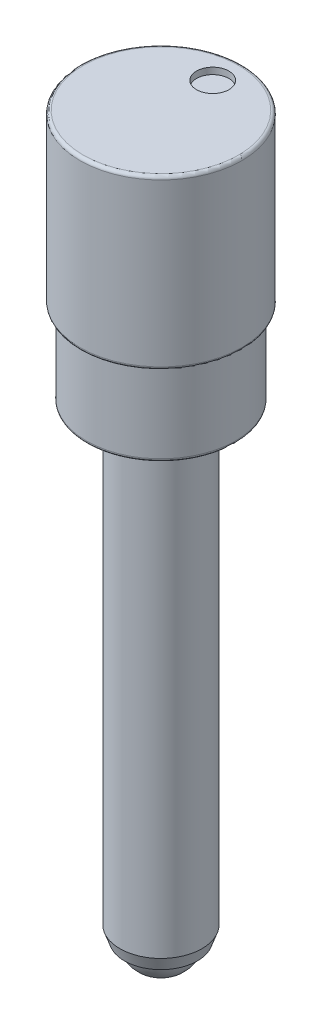
ISO-10303-21;
HEADER;
FILE_DESCRIPTION(('STEP AP214'),'2;1');
FILE_NAME('part.step','',(''),(''),'','','');
FILE_SCHEMA(('AUTOMOTIVE_DESIGN { 1 0 10303 214 1 1 1 1 }'));
ENDSEC;
DATA;
#1=APPLICATION_CONTEXT('core data for automotive mechanical design processes');
#2=APPLICATION_PROTOCOL_DEFINITION('international standard','automotive_design',2000,#1);
#3=PRODUCT_CONTEXT('',#1,'mechanical');
#4=PRODUCT('Part','Part','',(#3));
#5=PRODUCT_RELATED_PRODUCT_CATEGORY('part','',(#4));
#6=PRODUCT_DEFINITION_FORMATION('','',#4);
#7=PRODUCT_DEFINITION_CONTEXT('part definition',#1,'design');
#8=PRODUCT_DEFINITION('design','',#6,#7);
#9=PRODUCT_DEFINITION_SHAPE('','',#8);
#10=(LENGTH_UNIT() NAMED_UNIT(*) SI_UNIT(.MILLI.,.METRE.));
#11=(NAMED_UNIT(*) PLANE_ANGLE_UNIT() SI_UNIT($,.RADIAN.));
#12=(NAMED_UNIT(*) SI_UNIT($,.STERADIAN.) SOLID_ANGLE_UNIT());
#13=UNCERTAINTY_MEASURE_WITH_UNIT(LENGTH_MEASURE(1.E-05),#10,'distance_accuracy_value','');
#14=(GEOMETRIC_REPRESENTATION_CONTEXT(3) GLOBAL_UNCERTAINTY_ASSIGNED_CONTEXT((#13)) GLOBAL_UNIT_ASSIGNED_CONTEXT((#10,
#11,#12)) REPRESENTATION_CONTEXT('',''));
#15=CARTESIAN_POINT('',(0.,0.,0.));
#16=DIRECTION('',(0.,0.,1.));
#17=DIRECTION('',(1.,0.,0.));
#18=AXIS2_PLACEMENT_3D('',#15,#16,#17);
#19=CARTESIAN_POINT('',(0.,-41.5,0.));
#20=DIRECTION('',(0.,1.,0.));
#21=DIRECTION('',(0.,0.,-1.));
#22=AXIS2_PLACEMENT_3D('',#19,#20,#21);
#23=CONICAL_SURFACE('',#22,3.175,0.340339204138895);
#24=CARTESIAN_POINT('',(0.,-42.5,0.));
#25=DIRECTION('',(0.,-1.,0.));
#26=DIRECTION('',(0.,0.,-1.));
#27=AXIS2_PLACEMENT_3D('',#24,#25,#26);
#28=CIRCLE('',#27,2.8208814274693);
#29=CARTESIAN_POINT('',(0.,-42.5,-2.8208814274693));
#30=VERTEX_POINT('',#29);
#31=EDGE_CURVE('E51',#30,#30,#28,.T.);
#32=ORIENTED_EDGE('',*,*,#31,.F.);
#33=EDGE_LOOP('',(#32));
#34=FACE_BOUND('',#33,.T.);
#35=CARTESIAN_POINT('',(0.,-41.5,0.));
#36=DIRECTION('',(0.,-1.,0.));
#37=DIRECTION('',(0.,0.,-1.));
#38=AXIS2_PLACEMENT_3D('',#35,#36,#37);
#39=CIRCLE('',#38,3.175);
#40=CARTESIAN_POINT('',(0.,-41.5,-3.175));
#41=VERTEX_POINT('',#40);
#42=EDGE_CURVE('E55',#41,#41,#39,.T.);
#43=ORIENTED_EDGE('',*,*,#42,.T.);
#44=EDGE_LOOP('',(#43));
#45=FACE_BOUND('',#44,.T.);
#46=ADVANCED_FACE('F45',(#34,#45),#23,.T.);
#47=CARTESIAN_POINT('',(0.,-42.5,0.));
#48=DIRECTION('',(0.,-1.,0.));
#49=DIRECTION('',(0.,0.,-1.));
#50=AXIS2_PLACEMENT_3D('',#47,#48,#49);
#51=PLANE('',#50);
#52=CARTESIAN_POINT('',(0.,-42.5,0.));
#53=DIRECTION('',(0.,-1.,0.));
#54=DIRECTION('',(0.,0.,-1.));
#55=AXIS2_PLACEMENT_3D('',#52,#53,#54);
#56=CIRCLE('',#55,2.5);
#57=CARTESIAN_POINT('',(0.,-42.5,-2.5));
#58=VERTEX_POINT('',#57);
#59=EDGE_CURVE('E62',#58,#58,#56,.T.);
#60=ORIENTED_EDGE('',*,*,#59,.F.);
#61=EDGE_LOOP('',(#60));
#62=FACE_BOUND('',#61,.T.);
#63=ORIENTED_EDGE('',*,*,#31,.T.);
#64=EDGE_LOOP('',(#63));
#65=FACE_BOUND('',#64,.T.);
#66=ADVANCED_FACE('F88',(#62,#65),#51,.T.);
#67=CARTESIAN_POINT('',(0.,-41.5,0.));
#68=DIRECTION('',(0.,-1.,0.));
#69=DIRECTION('',(0.,0.,-1.));
#70=AXIS2_PLACEMENT_3D('',#67,#68,#69);
#71=PLANE('',#70);
#72=ORIENTED_EDGE('',*,*,#42,.F.);
#73=EDGE_LOOP('',(#72));
#74=FACE_BOUND('',#73,.T.);
#75=ADVANCED_FACE('F93',(#74),#71,.F.);
#76=CARTESIAN_POINT('',(0.,-42.,0.));
#77=DIRECTION('',(0.,-1.,0.));
#78=DIRECTION('',(0.,0.,-1.));
#79=AXIS2_PLACEMENT_3D('',#76,#77,#78);
#80=CYLINDRICAL_SURFACE('',#79,2.5);
#81=CARTESIAN_POINT('',(0.,-42.,0.));
#82=DIRECTION('',(0.,-1.,0.));
#83=DIRECTION('',(0.,0.,-1.));
#84=AXIS2_PLACEMENT_3D('',#81,#82,#83);
#85=CIRCLE('',#84,2.5);
#86=CARTESIAN_POINT('',(0.,-42.,-2.5));
#87=VERTEX_POINT('',#86);
#88=EDGE_CURVE('E59',#87,#87,#85,.T.);
#89=ORIENTED_EDGE('',*,*,#88,.F.);
#90=EDGE_LOOP('',(#89));
#91=FACE_BOUND('',#90,.T.);
#92=ORIENTED_EDGE('',*,*,#59,.T.);
#93=EDGE_LOOP('',(#92));
#94=FACE_BOUND('',#93,.T.);
#95=ADVANCED_FACE('F84',(#91,#94),#80,.F.);
#96=CARTESIAN_POINT('',(0.,-42.,0.));
#97=DIRECTION('',(-1.,0.,0.));
#98=DIRECTION('',(0.,0.,-1.));
#99=AXIS2_PLACEMENT_3D('',#96,#97,#98);
#100=SPHERICAL_SURFACE('',#99,2.5);
#101=CARTESIAN_POINT('',(0.,-42.,0.));
#102=DIRECTION('',(0.,-1.,0.));
#103=DIRECTION('',(0.,0.,-1.));
#104=AXIS2_PLACEMENT_3D('',#101,#102,#103);
#105=SPHERICAL_SURFACE('',#104,2.5);
#106=ORIENTED_EDGE('',*,*,#88,.T.);
#107=EDGE_LOOP('',(#106));
#108=FACE_BOUND('',#107,.T.);
#109=CARTESIAN_POINT('',(0.,-44.4988252600567,0.));
#110=DIRECTION('',(0.,0.999999999999999,0.));
#111=DIRECTION('',(0.,0.,1.));
#112=AXIS2_PLACEMENT_3D('',#109,#110,#111);
#113=CIRCLE('',#112,0.076631062256638);
#114=CARTESIAN_POINT('',(0.,-44.4988252600567,0.076631062256638));
#115=VERTEX_POINT('',#114);
#116=EDGE_CURVE('E11',#115,#115,#113,.T.);
#117=ORIENTED_EDGE('',*,*,#116,.T.);
#118=EDGE_LOOP('',(#117));
#119=FACE_BOUND('',#118,.T.);
#120=ADVANCED_FACE('F76',(#108,#119),#105,.T.);
#121=CARTESIAN_POINT('',(0.,-42.,0.));
#122=DIRECTION('',(-1.,0.,0.));
#123=DIRECTION('',(0.,0.,-1.));
#124=AXIS2_PLACEMENT_3D('',#121,#122,#123);
#125=SPHERICAL_SURFACE('',#124,2.51);
#126=CARTESIAN_POINT('',(0.,-42.,0.));
#127=DIRECTION('',(0.,1.,0.));
#128=DIRECTION('',(0.,0.,1.));
#129=AXIS2_PLACEMENT_3D('',#126,#127,#128);
#130=SPHERICAL_SURFACE('',#129,2.51);
#131=CARTESIAN_POINT('',(0.,-44.5088299424826,0.));
#132=DIRECTION('',(0.,1.,0.));
#133=DIRECTION('',(0.,0.,1.));
#134=AXIS2_PLACEMENT_3D('',#131,#132,#133);
#135=CIRCLE('',#134,0.076631062256638);
#136=CARTESIAN_POINT('',(0.,-44.5088299424826,0.076631062256638));
#137=VERTEX_POINT('',#136);
#138=EDGE_CURVE('E65',#137,#137,#135,.T.);
#139=ORIENTED_EDGE('',*,*,#138,.F.);
#140=EDGE_LOOP('',(#139));
#141=FACE_BOUND('',#140,.T.);
#142=ADVANCED_FACE('F74',(#141),#130,.T.);
#143=CARTESIAN_POINT('',(0.,-44.521,0.));
#144=DIRECTION('',(0.,1.,0.));
#145=DIRECTION('',(0.,0.,1.));
#146=AXIS2_PLACEMENT_3D('',#143,#144,#145);
#147=CYLINDRICAL_SURFACE('',#146,0.076631062256638);
#148=ORIENTED_EDGE('',*,*,#138,.T.);
#149=EDGE_LOOP('',(#148));
#150=FACE_BOUND('',#149,.T.);
#151=ORIENTED_EDGE('',*,*,#116,.F.);
#152=EDGE_LOOP('',(#151));
#153=FACE_BOUND('',#152,.T.);
#154=ADVANCED_FACE('F71',(#150,#153),#147,.T.);
#155=CLOSED_SHELL('',(#46,#66,#75,#95,#120,#142,#154));
#156=MANIFOLD_SOLID_BREP('B2',#155);
#157=CARTESIAN_POINT('',(0.,-41.5,0.));
#158=DIRECTION('',(0.,1.,0.));
#159=DIRECTION('',(0.,0.,1.));
#160=AXIS2_PLACEMENT_3D('',#157,#158,#159);
#161=CYLINDRICAL_SURFACE('',#160,3.175);
#162=CARTESIAN_POINT('',(0.,-41.5,0.));
#163=DIRECTION('',(0.,-1.,0.));
#164=DIRECTION('',(0.,0.,-1.));
#165=AXIS2_PLACEMENT_3D('',#162,#163,#164);
#166=CIRCLE('',#165,3.175);
#167=CARTESIAN_POINT('',(0.,-41.5,-3.175));
#168=VERTEX_POINT('',#167);
#169=EDGE_CURVE('E44',#168,#168,#166,.T.);
#170=ORIENTED_EDGE('',*,*,#169,.F.);
#171=EDGE_LOOP('',(#170));
#172=FACE_BOUND('',#171,.T.);
#173=CARTESIAN_POINT('',(0.,-6.5,0.));
#174=DIRECTION('',(0.,-1.,0.));
#175=DIRECTION('',(0.,0.,-1.));
#176=AXIS2_PLACEMENT_3D('',#173,#174,#175);
#177=CIRCLE('',#176,3.175);
#178=CARTESIAN_POINT('',(0.,-6.5,-3.175));
#179=VERTEX_POINT('',#178);
#180=EDGE_CURVE('E168',#179,#179,#177,.T.);
#181=ORIENTED_EDGE('',*,*,#180,.T.);
#182=EDGE_LOOP('',(#181));
#183=FACE_BOUND('',#182,.T.);
#184=ADVANCED_FACE('F165',(#172,#183),#161,.T.);
#185=CARTESIAN_POINT('',(0.,-41.5,0.));
#186=DIRECTION('',(0.,-1.,0.));
#187=DIRECTION('',(0.,0.,-1.));
#188=AXIS2_PLACEMENT_3D('',#185,#186,#187);
#189=PLANE('',#188);
#190=ORIENTED_EDGE('',*,*,#169,.T.);
#191=EDGE_LOOP('',(#190));
#192=FACE_BOUND('',#191,.T.);
#193=ADVANCED_FACE('F180',(#192),#189,.T.);
#194=CARTESIAN_POINT('',(0.,-6.5,0.));
#195=DIRECTION('',(0.,-1.,0.));
#196=DIRECTION('',(0.,0.,-1.));
#197=AXIS2_PLACEMENT_3D('',#194,#195,#196);
#198=PLANE('',#197);
#199=ORIENTED_EDGE('',*,*,#180,.F.);
#200=EDGE_LOOP('',(#199));
#201=FACE_BOUND('',#200,.T.);
#202=ADVANCED_FACE('F178',(#201),#198,.F.);
#203=CLOSED_SHELL('',(#184,#193,#202));
#204=MANIFOLD_SOLID_BREP('B6',#203);
#205=CARTESIAN_POINT('',(0.,13.,0.));
#206=DIRECTION('',(0.,-1.,0.));
#207=DIRECTION('',(0.,0.,-1.));
#208=AXIS2_PLACEMENT_3D('',#205,#206,#207);
#209=CYLINDRICAL_SURFACE('',#208,6.25);
#210=CARTESIAN_POINT('',(0.,0.25,0.));
#211=DIRECTION('',(0.,1.,0.));
#212=DIRECTION('',(0.,0.,1.));
#213=AXIS2_PLACEMENT_3D('',#210,#211,#212);
#214=CIRCLE('',#213,6.25);
#215=CARTESIAN_POINT('',(0.,0.25,-6.25));
#216=VERTEX_POINT('',#215);
#217=EDGE_CURVE('E220',#216,#216,#214,.T.);
#218=CARTESIAN_POINT('',(0.,12.75,0.));
#219=DIRECTION('',(0.,1.,0.));
#220=DIRECTION('',(0.,0.,1.));
#221=AXIS2_PLACEMENT_3D('',#218,#219,#220);
#222=CIRCLE('',#221,6.25);
#223=CARTESIAN_POINT('',(0.,12.75,-6.25));
#224=VERTEX_POINT('',#223);
#225=EDGE_CURVE('E224',#224,#224,#222,.F.);
#226=CARTESIAN_POINT('',(0.,0.25,-6.25));
#227=CARTESIAN_POINT('',(0.,0.380208333333334,-6.25));
#228=CARTESIAN_POINT('',(0.,0.510416666666667,-6.25));
#229=CARTESIAN_POINT('',(0.,0.770833333333334,-6.25));
#230=CARTESIAN_POINT('',(0.,0.901041666666668,-6.25));
#231=CARTESIAN_POINT('',(0.,1.16145833333333,-6.25));
#232=CARTESIAN_POINT('',(0.,1.29166666666667,-6.25));
#233=CARTESIAN_POINT('',(0.,1.55208333333333,-6.25));
#234=CARTESIAN_POINT('',(0.,1.68229166666667,-6.25));
#235=CARTESIAN_POINT('',(0.,1.94270833333333,-6.25));
#236=CARTESIAN_POINT('',(0.,2.07291666666667,-6.25));
#237=CARTESIAN_POINT('',(0.,2.33333333333333,-6.25));
#238=CARTESIAN_POINT('',(0.,2.46354166666667,-6.25));
#239=CARTESIAN_POINT('',(0.,2.72395833333333,-6.25));
#240=CARTESIAN_POINT('',(0.,2.85416666666667,-6.25));
#241=CARTESIAN_POINT('',(0.,3.11458333333333,-6.25));
#242=CARTESIAN_POINT('',(0.,3.24479166666667,-6.25));
#243=CARTESIAN_POINT('',(0.,3.50520833333333,-6.25));
#244=CARTESIAN_POINT('',(0.,3.63541666666667,-6.25));
#245=CARTESIAN_POINT('',(0.,3.89583333333333,-6.25));
#246=CARTESIAN_POINT('',(0.,4.02604166666667,-6.25));
#247=CARTESIAN_POINT('',(0.,4.28645833333333,-6.25));
#248=CARTESIAN_POINT('',(0.,4.41666666666667,-6.25));
#249=CARTESIAN_POINT('',(0.,4.67708333333333,-6.25));
#250=CARTESIAN_POINT('',(0.,4.80729166666667,-6.25));
#251=CARTESIAN_POINT('',(0.,5.06770833333333,-6.25));
#252=CARTESIAN_POINT('',(0.,5.19791666666667,-6.25));
#253=CARTESIAN_POINT('',(0.,5.45833333333333,-6.25));
#254=CARTESIAN_POINT('',(0.,5.58854166666667,-6.25));
#255=CARTESIAN_POINT('',(0.,5.84895833333333,-6.25));
#256=CARTESIAN_POINT('',(0.,5.97916666666667,-6.25));
#257=CARTESIAN_POINT('',(0.,6.23958333333333,-6.25));
#258=CARTESIAN_POINT('',(0.,6.36979166666667,-6.25));
#259=CARTESIAN_POINT('',(0.,6.63020833333333,-6.25));
#260=CARTESIAN_POINT('',(0.,6.76041666666667,-6.25));
#261=CARTESIAN_POINT('',(0.,7.02083333333333,-6.25));
#262=CARTESIAN_POINT('',(0.,7.15104166666667,-6.25));
#263=CARTESIAN_POINT('',(0.,7.41145833333333,-6.25));
#264=CARTESIAN_POINT('',(0.,7.54166666666667,-6.25));
#265=CARTESIAN_POINT('',(0.,7.80208333333333,-6.25));
#266=CARTESIAN_POINT('',(0.,7.93229166666667,-6.25));
#267=CARTESIAN_POINT('',(0.,8.19270833333333,-6.25));
#268=CARTESIAN_POINT('',(0.,8.32291666666667,-6.25));
#269=CARTESIAN_POINT('',(0.,8.58333333333333,-6.25));
#270=CARTESIAN_POINT('',(0.,8.71354166666667,-6.25));
#271=CARTESIAN_POINT('',(0.,8.97395833333333,-6.25));
#272=CARTESIAN_POINT('',(0.,9.10416666666667,-6.25));
#273=CARTESIAN_POINT('',(0.,9.36458333333333,-6.25));
#274=CARTESIAN_POINT('',(0.,9.49479166666667,-6.25));
#275=CARTESIAN_POINT('',(0.,9.75520833333333,-6.25));
#276=CARTESIAN_POINT('',(0.,9.88541666666667,-6.25));
#277=CARTESIAN_POINT('',(0.,10.1458333333333,-6.25));
#278=CARTESIAN_POINT('',(0.,10.2760416666667,-6.25));
#279=CARTESIAN_POINT('',(0.,10.5364583333333,-6.25));
#280=CARTESIAN_POINT('',(0.,10.6666666666667,-6.25));
#281=CARTESIAN_POINT('',(0.,10.9270833333333,-6.25));
#282=CARTESIAN_POINT('',(0.,11.0572916666667,-6.25));
#283=CARTESIAN_POINT('',(0.,11.3177083333333,-6.25));
#284=CARTESIAN_POINT('',(0.,11.4479166666667,-6.25));
#285=CARTESIAN_POINT('',(0.,11.7083333333333,-6.25));
#286=CARTESIAN_POINT('',(0.,11.8385416666667,-6.25));
#287=CARTESIAN_POINT('',(0.,12.0989583333333,-6.25));
#288=CARTESIAN_POINT('',(0.,12.2291666666667,-6.25));
#289=CARTESIAN_POINT('',(0.,12.4895833333333,-6.25));
#290=CARTESIAN_POINT('',(0.,12.6197916666667,-6.25));
#291=CARTESIAN_POINT('',(0.,12.75,-6.25));
#292=B_SPLINE_CURVE_WITH_KNOTS('',3,(#226,#227,#228,#229,#230,#231,#232,#233,#234,#235,#236,
#237,#238,#239,#240,#241,#242,#243,#244,#245,#246,#247,#248,#249,#250,#251,#252,#253,#254,#255,
#256,#257,#258,#259,#260,#261,#262,#263,#264,#265,#266,#267,#268,#269,#270,#271,#272,#273,#274,
#275,#276,#277,#278,#279,#280,#281,#282,#283,#284,#285,#286,#287,#288,#289,#290,#291),
.UNSPECIFIED.,.F.,.F.,(4,2,2,2,2,2,2,2,2,2,2,2,2,2,2,2,2,2,2,2,2,2,2,2,2,2,2,2,2,2,2,2,4),(0.,
0.390625,0.781250000000001,1.171875,1.5625,1.953125,2.34375,2.734375,3.125,3.515625,3.90625,
4.296875,4.6875,5.078125,5.46875,5.859375,6.25,6.640625,7.03125,7.421875,7.8125,8.203125,
8.59375,8.984375,9.375,9.765625,10.15625,10.546875,10.9375,11.328125,11.71875,12.109375,12.5),.UNSPECIFIED.);
#293=EDGE_CURVE('BSEAM209',#216,#224,#292,.T.);
#294=ORIENTED_EDGE('',*,*,#217,.T.);
#295=ORIENTED_EDGE('',*,*,#225,.T.);
#296=ORIENTED_EDGE('',*,*,#293,.T.);
#297=ORIENTED_EDGE('',*,*,#293,.F.);
#298=EDGE_LOOP('',(#294,#296,#295,#297));
#299=FACE_BOUND('',#298,.T.);
#300=ADVANCED_FACE('F209',(#299),#209,.T.);
#301=CARTESIAN_POINT('',(0.,13.,0.));
#302=DIRECTION('',(0.,1.,0.));
#303=DIRECTION('',(0.,0.,1.));
#304=AXIS2_PLACEMENT_3D('',#301,#302,#303);
#305=PLANE('',#304);
#306=CARTESIAN_POINT('',(0.,13.,-4.));
#307=DIRECTION('',(0.,1.,0.));
#308=DIRECTION('',(0.,0.,1.));
#309=AXIS2_PLACEMENT_3D('',#306,#307,#308);
#310=CIRCLE('',#309,1.25);
#311=CARTESIAN_POINT('',(0.,13.,-2.75));
#312=VERTEX_POINT('',#311);
#313=EDGE_CURVE('E239',#312,#312,#310,.T.);
#314=ORIENTED_EDGE('',*,*,#313,.F.);
#315=EDGE_LOOP('',(#314));
#316=FACE_BOUND('',#315,.T.);
#317=CARTESIAN_POINT('',(0.,13.,0.));
#318=DIRECTION('',(0.,1.,0.));
#319=DIRECTION('',(0.,0.,1.));
#320=AXIS2_PLACEMENT_3D('',#317,#318,#319);
#321=CIRCLE('',#320,6.);
#322=CARTESIAN_POINT('',(0.,13.,6.));
#323=VERTEX_POINT('',#322);
#324=EDGE_CURVE('E164',#323,#323,#321,.T.);
#325=ORIENTED_EDGE('',*,*,#324,.T.);
#326=EDGE_LOOP('',(#325));
#327=FACE_BOUND('',#326,.T.);
#328=ADVANCED_FACE('F253',(#316,#327),#305,.T.);
#329=CARTESIAN_POINT('',(0.,0.,0.));
#330=DIRECTION('',(0.,1.,0.));
#331=DIRECTION('',(0.,0.,1.));
#332=AXIS2_PLACEMENT_3D('',#329,#330,#331);
#333=PLANE('',#332);
#334=CARTESIAN_POINT('',(0.,0.,0.));
#335=DIRECTION('',(0.,1.,0.));
#336=DIRECTION('',(0.,0.,1.));
#337=AXIS2_PLACEMENT_3D('',#334,#335,#336);
#338=CIRCLE('',#337,6.);
#339=CARTESIAN_POINT('',(0.,0.,6.));
#340=VERTEX_POINT('',#339);
#341=EDGE_CURVE('E216',#340,#340,#338,.F.);
#342=ORIENTED_EDGE('',*,*,#341,.T.);
#343=EDGE_LOOP('',(#342));
#344=FACE_BOUND('',#343,.T.);
#345=CARTESIAN_POINT('',(0.,0.,0.));
#346=DIRECTION('',(0.,1.,0.));
#347=DIRECTION('',(0.,0.,1.));
#348=AXIS2_PLACEMENT_3D('',#345,#346,#347);
#349=CIRCLE('',#348,5.75);
#350=CARTESIAN_POINT('',(0.,0.,5.75));
#351=VERTEX_POINT('',#350);
#352=EDGE_CURVE('E235',#351,#351,#349,.F.);
#353=ORIENTED_EDGE('',*,*,#352,.F.);
#354=EDGE_LOOP('',(#353));
#355=FACE_BOUND('',#354,.T.);
#356=ADVANCED_FACE('F255',(#344,#355),#333,.F.);
#357=CARTESIAN_POINT('',(0.,-6.5,0.));
#358=DIRECTION('',(0.,1.,0.));
#359=DIRECTION('',(0.,0.,1.));
#360=AXIS2_PLACEMENT_3D('',#357,#358,#359);
#361=CYLINDRICAL_SURFACE('',#360,5.75);
#362=CARTESIAN_POINT('',(0.,-6.25,0.));
#363=DIRECTION('',(0.,-1.,0.));
#364=DIRECTION('',(0.,0.,-1.));
#365=AXIS2_PLACEMENT_3D('',#362,#363,#364);
#366=CIRCLE('',#365,5.75);
#367=CARTESIAN_POINT('',(0.,-6.25,5.75));
#368=VERTEX_POINT('',#367);
#369=EDGE_CURVE('E229',#368,#368,#366,.F.);
#370=CARTESIAN_POINT('',(0.,-6.25,5.75));
#371=CARTESIAN_POINT('',(0.,-6.18489583333333,5.75));
#372=CARTESIAN_POINT('',(0.,-6.11979166666667,5.75));
#373=CARTESIAN_POINT('',(0.,-5.98958333333333,5.75));
#374=CARTESIAN_POINT('',(0.,-5.92447916666667,5.75));
#375=CARTESIAN_POINT('',(0.,-5.79427083333333,5.75));
#376=CARTESIAN_POINT('',(0.,-5.72916666666667,5.75));
#377=CARTESIAN_POINT('',(0.,-5.59895833333333,5.75));
#378=CARTESIAN_POINT('',(0.,-5.53385416666667,5.75));
#379=CARTESIAN_POINT('',(0.,-5.40364583333333,5.75));
#380=CARTESIAN_POINT('',(0.,-5.33854166666667,5.75));
#381=CARTESIAN_POINT('',(0.,-5.20833333333333,5.75));
#382=CARTESIAN_POINT('',(0.,-5.14322916666667,5.75));
#383=CARTESIAN_POINT('',(0.,-5.01302083333333,5.75));
#384=CARTESIAN_POINT('',(0.,-4.94791666666667,5.75));
#385=CARTESIAN_POINT('',(0.,-4.81770833333333,5.75));
#386=CARTESIAN_POINT('',(0.,-4.75260416666667,5.75));
#387=CARTESIAN_POINT('',(0.,-4.62239583333333,5.75));
#388=CARTESIAN_POINT('',(0.,-4.55729166666667,5.75));
#389=CARTESIAN_POINT('',(0.,-4.42708333333333,5.75));
#390=CARTESIAN_POINT('',(0.,-4.36197916666667,5.75));
#391=CARTESIAN_POINT('',(0.,-4.23177083333333,5.75));
#392=CARTESIAN_POINT('',(0.,-4.16666666666667,5.75));
#393=CARTESIAN_POINT('',(0.,-4.03645833333333,5.75));
#394=CARTESIAN_POINT('',(0.,-3.97135416666667,5.75));
#395=CARTESIAN_POINT('',(0.,-3.84114583333333,5.75));
#396=CARTESIAN_POINT('',(0.,-3.77604166666667,5.75));
#397=CARTESIAN_POINT('',(0.,-3.64583333333333,5.75));
#398=CARTESIAN_POINT('',(0.,-3.58072916666667,5.75));
#399=CARTESIAN_POINT('',(0.,-3.45052083333333,5.75));
#400=CARTESIAN_POINT('',(0.,-3.38541666666667,5.75));
#401=CARTESIAN_POINT('',(0.,-3.25520833333333,5.75));
#402=CARTESIAN_POINT('',(0.,-3.19010416666667,5.75));
#403=CARTESIAN_POINT('',(0.,-3.05989583333333,5.75));
#404=CARTESIAN_POINT('',(0.,-2.99479166666667,5.75));
#405=CARTESIAN_POINT('',(0.,-2.86458333333333,5.75));
#406=CARTESIAN_POINT('',(0.,-2.79947916666667,5.75));
#407=CARTESIAN_POINT('',(0.,-2.66927083333333,5.75));
#408=CARTESIAN_POINT('',(0.,-2.60416666666667,5.75));
#409=CARTESIAN_POINT('',(0.,-2.47395833333333,5.75));
#410=CARTESIAN_POINT('',(0.,-2.40885416666667,5.75));
#411=CARTESIAN_POINT('',(0.,-2.27864583333333,5.75));
#412=CARTESIAN_POINT('',(0.,-2.21354166666667,5.75));
#413=CARTESIAN_POINT('',(0.,-2.08333333333333,5.75));
#414=CARTESIAN_POINT('',(0.,-2.01822916666667,5.75));
#415=CARTESIAN_POINT('',(0.,-1.88802083333333,5.75));
#416=CARTESIAN_POINT('',(0.,-1.82291666666667,5.75));
#417=CARTESIAN_POINT('',(0.,-1.69270833333333,5.75));
#418=CARTESIAN_POINT('',(0.,-1.62760416666667,5.75));
#419=CARTESIAN_POINT('',(0.,-1.49739583333333,5.75));
#420=CARTESIAN_POINT('',(0.,-1.43229166666667,5.75));
#421=CARTESIAN_POINT('',(0.,-1.30208333333333,5.75));
#422=CARTESIAN_POINT('',(0.,-1.23697916666667,5.75));
#423=CARTESIAN_POINT('',(0.,-1.10677083333333,5.75));
#424=CARTESIAN_POINT('',(0.,-1.04166666666667,5.75));
#425=CARTESIAN_POINT('',(0.,-0.911458333333333,5.75));
#426=CARTESIAN_POINT('',(0.,-0.846354166666666,5.75));
#427=CARTESIAN_POINT('',(0.,-0.716145833333332,5.75));
#428=CARTESIAN_POINT('',(0.,-0.651041666666666,5.75));
#429=CARTESIAN_POINT('',(0.,-0.520833333333333,5.75));
#430=CARTESIAN_POINT('',(0.,-0.455729166666667,5.75));
#431=CARTESIAN_POINT('',(0.,-0.325520833333333,5.75));
#432=CARTESIAN_POINT('',(0.,-0.260416666666666,5.75));
#433=CARTESIAN_POINT('',(0.,-0.130208333333333,5.75));
#434=CARTESIAN_POINT('',(0.,-0.0651041666666664,5.75));
#435=CARTESIAN_POINT('',(0.,0.,5.75));
#436=B_SPLINE_CURVE_WITH_KNOTS('',3,(#370,#371,#372,#373,#374,#375,#376,#377,#378,#379,#380,
#381,#382,#383,#384,#385,#386,#387,#388,#389,#390,#391,#392,#393,#394,#395,#396,#397,#398,#399,
#400,#401,#402,#403,#404,#405,#406,#407,#408,#409,#410,#411,#412,#413,#414,#415,#416,#417,#418,
#419,#420,#421,#422,#423,#424,#425,#426,#427,#428,#429,#430,#431,#432,#433,#434,#435),
.UNSPECIFIED.,.F.,.F.,(4,2,2,2,2,2,2,2,2,2,2,2,2,2,2,2,2,2,2,2,2,2,2,2,2,2,2,2,2,2,2,2,4),(0.,
0.1953125,0.390625,0.585937500000001,0.78125,0.9765625,1.171875,1.3671875,1.5625,1.7578125,
1.953125,2.1484375,2.34375,2.5390625,2.734375,2.9296875,3.125,3.3203125,3.515625,3.7109375,
3.90625,4.1015625,4.296875,4.4921875,4.6875,4.8828125,5.078125,5.2734375,5.46875,5.6640625,
5.859375,6.0546875,6.25),.UNSPECIFIED.);
#437=EDGE_CURVE('BSEAM262',#368,#351,#436,.T.);
#438=ORIENTED_EDGE('',*,*,#369,.T.);
#439=ORIENTED_EDGE('',*,*,#352,.T.);
#440=ORIENTED_EDGE('',*,*,#437,.T.);
#441=ORIENTED_EDGE('',*,*,#437,.F.);
#442=EDGE_LOOP('',(#438,#440,#439,#441));
#443=FACE_BOUND('',#442,.T.);
#444=ADVANCED_FACE('F262',(#443),#361,.T.);
#445=CARTESIAN_POINT('',(0.,-6.5,0.));
#446=DIRECTION('',(0.,-1.,0.));
#447=DIRECTION('',(0.,0.,-1.));
#448=AXIS2_PLACEMENT_3D('',#445,#446,#447);
#449=PLANE('',#448);
#450=CARTESIAN_POINT('',(0.,-6.5,0.));
#451=DIRECTION('',(0.,-1.,0.));
#452=DIRECTION('',(0.,0.,-1.));
#453=AXIS2_PLACEMENT_3D('',#450,#451,#452);
#454=CIRCLE('',#453,5.5);
#455=CARTESIAN_POINT('',(0.,-6.5,-5.5));
#456=VERTEX_POINT('',#455);
#457=EDGE_CURVE('E232',#456,#456,#454,.T.);
#458=ORIENTED_EDGE('',*,*,#457,.T.);
#459=EDGE_LOOP('',(#458));
#460=FACE_BOUND('',#459,.T.);
#461=ADVANCED_FACE('F272',(#460),#449,.T.);
#462=CARTESIAN_POINT('',(0.,-6.25,0.));
#463=DIRECTION('',(0.,-1.,0.));
#464=DIRECTION('',(0.,0.,-1.));
#465=AXIS2_PLACEMENT_3D('',#462,#463,#464);
#466=TOROIDAL_SURFACE('',#465,5.5,0.25);
#467=ORIENTED_EDGE('',*,*,#369,.F.);
#468=EDGE_LOOP('',(#467));
#469=FACE_BOUND('',#468,.T.);
#470=ORIENTED_EDGE('',*,*,#457,.F.);
#471=EDGE_LOOP('',(#470));
#472=FACE_BOUND('',#471,.T.);
#473=ADVANCED_FACE('F269',(#469,#472),#466,.T.);
#474=CARTESIAN_POINT('',(0.,0.25,0.));
#475=DIRECTION('',(0.,1.,0.));
#476=DIRECTION('',(0.,0.,1.));
#477=AXIS2_PLACEMENT_3D('',#474,#475,#476);
#478=TOROIDAL_SURFACE('',#477,6.,0.25);
#479=ORIENTED_EDGE('',*,*,#341,.F.);
#480=EDGE_LOOP('',(#479));
#481=FACE_BOUND('',#480,.T.);
#482=ORIENTED_EDGE('',*,*,#217,.F.);
#483=EDGE_LOOP('',(#482));
#484=FACE_BOUND('',#483,.T.);
#485=ADVANCED_FACE('F271',(#481,#484),#478,.T.);
#486=CARTESIAN_POINT('',(0.,12.75,0.));
#487=DIRECTION('',(0.,1.,0.));
#488=DIRECTION('',(0.,0.,1.));
#489=AXIS2_PLACEMENT_3D('',#486,#487,#488);
#490=TOROIDAL_SURFACE('',#489,6.,0.25);
#491=ORIENTED_EDGE('',*,*,#225,.F.);
#492=EDGE_LOOP('',(#491));
#493=FACE_BOUND('',#492,.T.);
#494=ORIENTED_EDGE('',*,*,#324,.F.);
#495=EDGE_LOOP('',(#494));
#496=FACE_BOUND('',#495,.T.);
#497=ADVANCED_FACE('F211',(#493,#496),#490,.T.);
#498=CARTESIAN_POINT('',(0.,12.5,-4.));
#499=DIRECTION('',(0.,1.,0.));
#500=DIRECTION('',(0.,0.,1.));
#501=AXIS2_PLACEMENT_3D('',#498,#499,#500);
#502=CYLINDRICAL_SURFACE('',#501,1.25);
#503=CARTESIAN_POINT('',(0.,12.5,-4.));
#504=DIRECTION('',(0.,1.,0.));
#505=DIRECTION('',(0.,0.,1.));
#506=AXIS2_PLACEMENT_3D('',#503,#504,#505);
#507=CIRCLE('',#506,1.25);
#508=CARTESIAN_POINT('',(0.,12.5,-2.75));
#509=VERTEX_POINT('',#508);
#510=EDGE_CURVE('E238',#509,#509,#507,.T.);
#511=ORIENTED_EDGE('',*,*,#510,.F.);
#512=EDGE_LOOP('',(#511));
#513=FACE_BOUND('',#512,.T.);
#514=ORIENTED_EDGE('',*,*,#313,.T.);
#515=EDGE_LOOP('',(#514));
#516=FACE_BOUND('',#515,.T.);
#517=ADVANCED_FACE('F247',(#513,#516),#502,.F.);
#518=CARTESIAN_POINT('',(0.,12.5,-4.));
#519=DIRECTION('',(0.,1.,0.));
#520=DIRECTION('',(0.,0.,1.));
#521=AXIS2_PLACEMENT_3D('',#518,#519,#520);
#522=PLANE('',#521);
#523=ORIENTED_EDGE('',*,*,#510,.T.);
#524=EDGE_LOOP('',(#523));
#525=FACE_BOUND('',#524,.T.);
#526=ADVANCED_FACE('F245',(#525),#522,.T.);
#527=CLOSED_SHELL('',(#300,#328,#356,#444,#461,#473,#485,#497,#517,#526));
#528=MANIFOLD_SOLID_BREP('B39',#527);
#529=ADVANCED_BREP_SHAPE_REPRESENTATION('',(#18,#156,#204,#528),#14);
#530=SHAPE_DEFINITION_REPRESENTATION(#9,#529);
ENDSEC;
END-ISO-10303-21;
